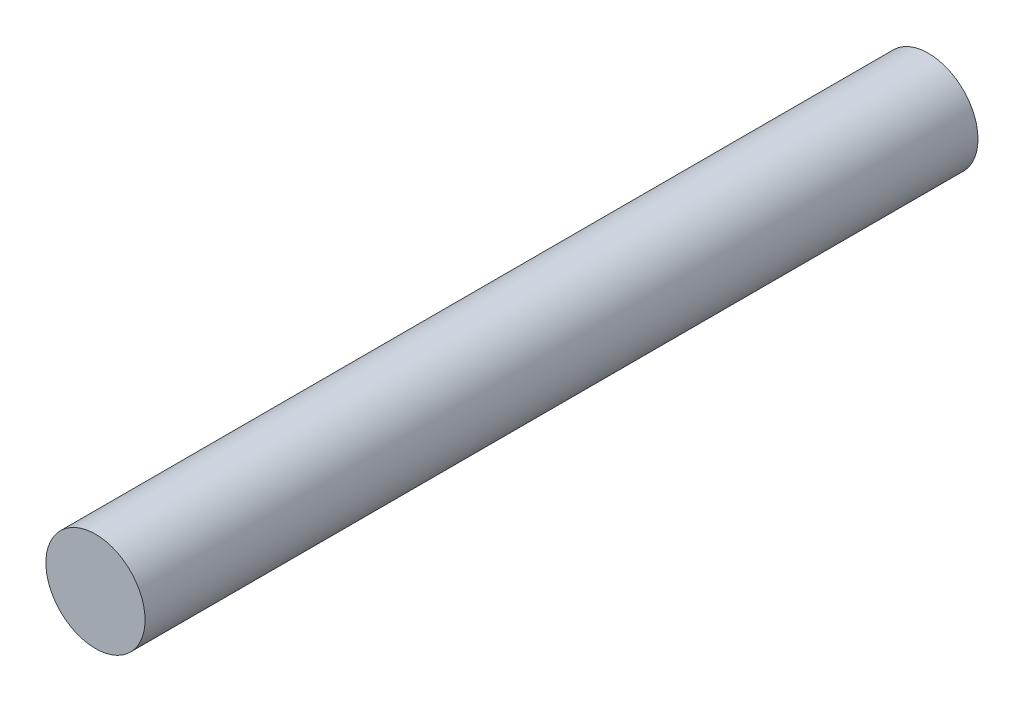
ISO-10303-21;
HEADER;
FILE_DESCRIPTION(('STEP AP214'),'2;1');
FILE_NAME('part.step','',(''),(''),'','','');
FILE_SCHEMA(('AUTOMOTIVE_DESIGN { 1 0 10303 214 1 1 1 1 }'));
ENDSEC;
DATA;
#1=APPLICATION_CONTEXT('core data for automotive mechanical design processes');
#2=APPLICATION_PROTOCOL_DEFINITION('international standard','automotive_design',2000,#1);
#3=PRODUCT_CONTEXT('',#1,'mechanical');
#4=PRODUCT('Part','Part','',(#3));
#5=PRODUCT_RELATED_PRODUCT_CATEGORY('part','',(#4));
#6=PRODUCT_DEFINITION_FORMATION('','',#4);
#7=PRODUCT_DEFINITION_CONTEXT('part definition',#1,'design');
#8=PRODUCT_DEFINITION('design','',#6,#7);
#9=PRODUCT_DEFINITION_SHAPE('','',#8);
#10=(LENGTH_UNIT() NAMED_UNIT(*) SI_UNIT(.MILLI.,.METRE.));
#11=(NAMED_UNIT(*) PLANE_ANGLE_UNIT() SI_UNIT($,.RADIAN.));
#12=(NAMED_UNIT(*) SI_UNIT($,.STERADIAN.) SOLID_ANGLE_UNIT());
#13=UNCERTAINTY_MEASURE_WITH_UNIT(LENGTH_MEASURE(1.E-05),#10,'distance_accuracy_value','');
#14=(GEOMETRIC_REPRESENTATION_CONTEXT(3) GLOBAL_UNCERTAINTY_ASSIGNED_CONTEXT((#13)) GLOBAL_UNIT_ASSIGNED_CONTEXT((#10,
#11,#12)) REPRESENTATION_CONTEXT('',''));
#15=CARTESIAN_POINT('',(0.,0.,0.));
#16=DIRECTION('',(0.,0.,1.));
#17=DIRECTION('',(1.,0.,0.));
#18=AXIS2_PLACEMENT_3D('',#15,#16,#17);
#19=CARTESIAN_POINT('',(0.499999,0.,8.40000098));
#20=DIRECTION('',(0.,0.,-1.));
#21=DIRECTION('',(0.,-1.,0.));
#22=AXIS2_PLACEMENT_3D('',#19,#20,#21);
#23=PLANE('',#22);
#24=CARTESIAN_POINT('',(0.,0.,8.40000098));
#25=DIRECTION('',(0.,0.,1.));
#26=DIRECTION('',(1.,0.,0.));
#27=AXIS2_PLACEMENT_3D('',#24,#25,#26);
#28=CIRCLE('',#27,0.499999);
#29=CARTESIAN_POINT('',(0.499999,0.,8.40000098));
#30=VERTEX_POINT('',#29);
#31=EDGE_CURVE('E11',#30,#30,#28,.T.);
#32=ORIENTED_EDGE('',*,*,#31,.T.);
#33=EDGE_LOOP('',(#32));
#34=FACE_BOUND('',#33,.T.);
#35=ADVANCED_FACE('F16',(#34),#23,.F.);
#36=CARTESIAN_POINT('',(0.499999,0.,0.));
#37=DIRECTION('',(0.,0.,-1.));
#38=DIRECTION('',(0.,-1.,0.));
#39=AXIS2_PLACEMENT_3D('',#36,#37,#38);
#40=PLANE('',#39);
#41=CARTESIAN_POINT('',(0.,0.,0.));
#42=DIRECTION('',(0.,0.,1.));
#43=DIRECTION('',(1.,0.,0.));
#44=AXIS2_PLACEMENT_3D('',#41,#42,#43);
#45=CIRCLE('',#44,0.499999);
#46=CARTESIAN_POINT('',(0.499999,0.,0.));
#47=VERTEX_POINT('',#46);
#48=EDGE_CURVE('E20',#47,#47,#45,.T.);
#49=ORIENTED_EDGE('',*,*,#48,.F.);
#50=EDGE_LOOP('',(#49));
#51=FACE_BOUND('',#50,.T.);
#52=ADVANCED_FACE('F57',(#51),#40,.T.);
#53=CARTESIAN_POINT('',(0.,0.,0.));
#54=DIRECTION('',(0.,0.,-1.));
#55=DIRECTION('',(1.,0.,0.));
#56=AXIS2_PLACEMENT_3D('',#53,#54,#55);
#57=CYLINDRICAL_SURFACE('',#56,0.499999);
#58=ORIENTED_EDGE('',*,*,#48,.T.);
#59=DIRECTION('',(0.,0.,1.));
#60=VECTOR('',#59,1.);
#61=CARTESIAN_POINT('',(0.499999,0.,0.));
#62=LINE('',#61,#60);
#63=EDGE_CURVE('E27',#47,#30,#62,.T.);
#64=ORIENTED_EDGE('',*,*,#63,.T.);
#65=ORIENTED_EDGE('',*,*,#31,.F.);
#66=ORIENTED_EDGE('',*,*,#63,.F.);
#67=EDGE_LOOP('',(#58,#64,#65,#66));
#68=FACE_BOUND('',#67,.T.);
#69=ADVANCED_FACE('F18',(#68),#57,.T.);
#70=CLOSED_SHELL('',(#35,#52,#69));
#71=MANIFOLD_SOLID_BREP('B1',#70);
#72=ADVANCED_BREP_SHAPE_REPRESENTATION('',(#18,#71),#14);
#73=SHAPE_DEFINITION_REPRESENTATION(#9,#72);
ENDSEC;
END-ISO-10303-21;
